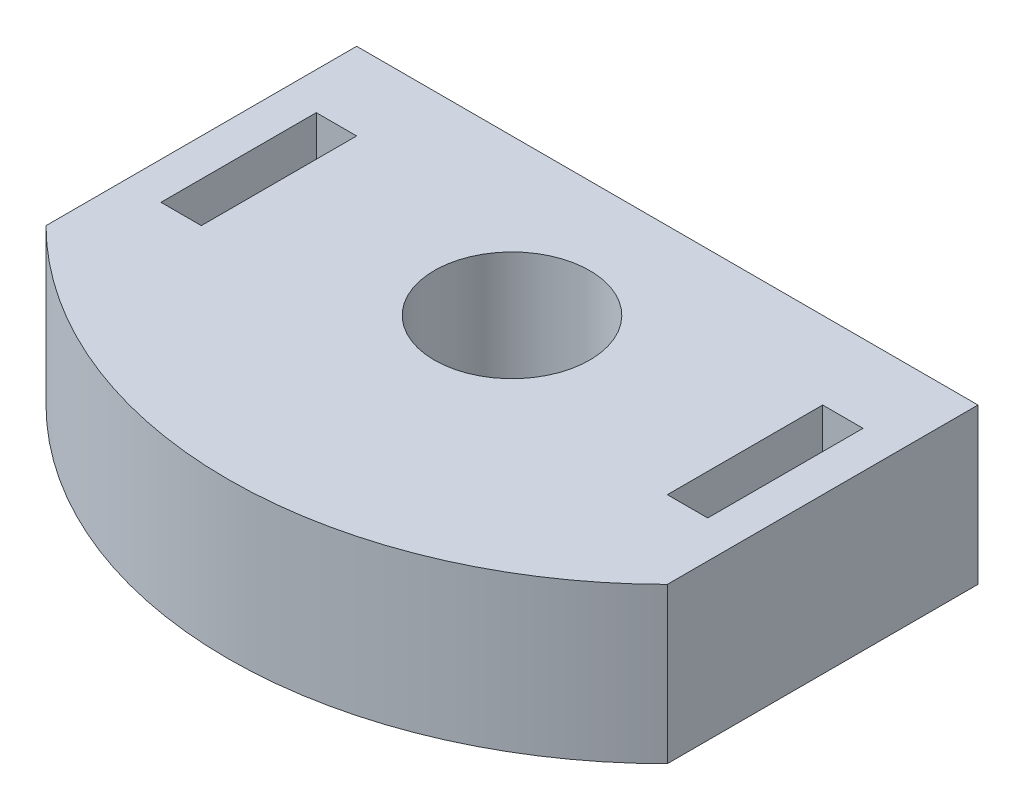
ISO-10303-21;
HEADER;
FILE_DESCRIPTION(('STEP AP214'),'2;1');
FILE_NAME('part.step','',(''),(''),'','','');
FILE_SCHEMA(('AUTOMOTIVE_DESIGN { 1 0 10303 214 1 1 1 1 }'));
ENDSEC;
DATA;
#1=APPLICATION_CONTEXT('core data for automotive mechanical design processes');
#2=APPLICATION_PROTOCOL_DEFINITION('international standard','automotive_design',2000,#1);
#3=PRODUCT_CONTEXT('',#1,'mechanical');
#4=PRODUCT('Part','Part','',(#3));
#5=PRODUCT_RELATED_PRODUCT_CATEGORY('part','',(#4));
#6=PRODUCT_DEFINITION_FORMATION('','',#4);
#7=PRODUCT_DEFINITION_CONTEXT('part definition',#1,'design');
#8=PRODUCT_DEFINITION('design','',#6,#7);
#9=PRODUCT_DEFINITION_SHAPE('','',#8);
#10=(LENGTH_UNIT() NAMED_UNIT(*) SI_UNIT(.MILLI.,.METRE.));
#11=(NAMED_UNIT(*) PLANE_ANGLE_UNIT() SI_UNIT($,.RADIAN.));
#12=(NAMED_UNIT(*) SI_UNIT($,.STERADIAN.) SOLID_ANGLE_UNIT());
#13=UNCERTAINTY_MEASURE_WITH_UNIT(LENGTH_MEASURE(1.E-05),#10,'distance_accuracy_value','');
#14=(GEOMETRIC_REPRESENTATION_CONTEXT(3) GLOBAL_UNCERTAINTY_ASSIGNED_CONTEXT((#13)) GLOBAL_UNIT_ASSIGNED_CONTEXT((#10,
#11,#12)) REPRESENTATION_CONTEXT('',''));
#15=CARTESIAN_POINT('',(0.,0.,0.));
#16=DIRECTION('',(0.,0.,1.));
#17=DIRECTION('',(1.,0.,0.));
#18=AXIS2_PLACEMENT_3D('',#15,#16,#17);
#19=CARTESIAN_POINT('',(-20.,10.,0.));
#20=DIRECTION('',(-1.,0.,0.));
#21=DIRECTION('',(0.,0.,1.));
#22=AXIS2_PLACEMENT_3D('',#19,#20,#21);
#23=PLANE('',#22);
#24=DIRECTION('',(0.,0.,-1.));
#25=VECTOR('',#24,1.);
#26=CARTESIAN_POINT('',(-20.,0.,0.));
#27=LINE('',#26,#25);
#28=CARTESIAN_POINT('',(-20.,0.,10.));
#29=VERTEX_POINT('',#28);
#30=CARTESIAN_POINT('',(-20.,0.,-10.));
#31=VERTEX_POINT('',#30);
#32=EDGE_CURVE('E237',#29,#31,#27,.T.);
#33=ORIENTED_EDGE('',*,*,#32,.F.);
#34=DIRECTION('',(0.,-1.,0.));
#35=VECTOR('',#34,1.);
#36=CARTESIAN_POINT('',(-20.,10.,10.));
#37=LINE('',#36,#35);
#38=CARTESIAN_POINT('',(-20.,10.,10.));
#39=VERTEX_POINT('',#38);
#40=EDGE_CURVE('E12',#39,#29,#37,.T.);
#41=ORIENTED_EDGE('',*,*,#40,.F.);
#42=DIRECTION('',(0.,0.,-1.));
#43=VECTOR('',#42,1.);
#44=CARTESIAN_POINT('',(-20.,10.,0.));
#45=LINE('',#44,#43);
#46=CARTESIAN_POINT('',(-20.,10.,-10.));
#47=VERTEX_POINT('',#46);
#48=EDGE_CURVE('E153',#39,#47,#45,.T.);
#49=ORIENTED_EDGE('',*,*,#48,.T.);
#50=DIRECTION('',(0.,-1.,0.));
#51=VECTOR('',#50,1.);
#52=CARTESIAN_POINT('',(-20.,10.,-10.));
#53=LINE('',#52,#51);
#54=EDGE_CURVE('E62',#47,#31,#53,.T.);
#55=ORIENTED_EDGE('',*,*,#54,.T.);
#56=EDGE_LOOP('',(#33,#41,#49,#55));
#57=FACE_BOUND('',#56,.T.);
#58=ADVANCED_FACE('F42',(#57),#23,.T.);
#59=CARTESIAN_POINT('',(0.,10.,-9.99999999999999));
#60=DIRECTION('',(0.,-1.,0.));
#61=DIRECTION('',(0.,0.,-1.));
#62=AXIS2_PLACEMENT_3D('',#59,#60,#61);
#63=CYLINDRICAL_SURFACE('',#62,28.2842712474619);
#64=CARTESIAN_POINT('',(0.,0.,-9.99999999999999));
#65=DIRECTION('',(0.,1.,0.));
#66=DIRECTION('',(0.,0.,1.));
#67=AXIS2_PLACEMENT_3D('',#64,#65,#66);
#68=CIRCLE('',#67,28.2842712474619);
#69=CARTESIAN_POINT('',(20.,0.,10.));
#70=VERTEX_POINT('',#69);
#71=EDGE_CURVE('E159',#29,#70,#68,.T.);
#72=ORIENTED_EDGE('',*,*,#71,.T.);
#73=DIRECTION('',(0.,-1.,0.));
#74=VECTOR('',#73,1.);
#75=CARTESIAN_POINT('',(20.,10.,10.));
#76=LINE('',#75,#74);
#77=CARTESIAN_POINT('',(20.,10.,10.));
#78=VERTEX_POINT('',#77);
#79=EDGE_CURVE('E53',#78,#70,#76,.T.);
#80=ORIENTED_EDGE('',*,*,#79,.F.);
#81=CARTESIAN_POINT('',(0.,10.,-9.99999999999999));
#82=DIRECTION('',(0.,1.,0.));
#83=DIRECTION('',(0.,0.,1.));
#84=AXIS2_PLACEMENT_3D('',#81,#82,#83);
#85=CIRCLE('',#84,28.2842712474619);
#86=EDGE_CURVE('E148',#39,#78,#85,.T.);
#87=ORIENTED_EDGE('',*,*,#86,.F.);
#88=ORIENTED_EDGE('',*,*,#40,.T.);
#89=EDGE_LOOP('',(#72,#80,#87,#88));
#90=FACE_BOUND('',#89,.T.);
#91=ADVANCED_FACE('F157',(#90),#63,.T.);
#92=CARTESIAN_POINT('',(20.,10.,0.));
#93=DIRECTION('',(-1.,0.,0.));
#94=DIRECTION('',(0.,0.,1.));
#95=AXIS2_PLACEMENT_3D('',#92,#93,#94);
#96=PLANE('',#95);
#97=DIRECTION('',(0.,0.,-1.));
#98=VECTOR('',#97,1.);
#99=CARTESIAN_POINT('',(20.,0.,0.));
#100=LINE('',#99,#98);
#101=CARTESIAN_POINT('',(20.,0.,-10.));
#102=VERTEX_POINT('',#101);
#103=EDGE_CURVE('E242',#70,#102,#100,.T.);
#104=ORIENTED_EDGE('',*,*,#103,.T.);
#105=DIRECTION('',(0.,-1.,0.));
#106=VECTOR('',#105,1.);
#107=CARTESIAN_POINT('',(20.,10.,-10.));
#108=LINE('',#107,#106);
#109=CARTESIAN_POINT('',(20.,10.,-10.));
#110=VERTEX_POINT('',#109);
#111=EDGE_CURVE('E100',#110,#102,#108,.T.);
#112=ORIENTED_EDGE('',*,*,#111,.F.);
#113=DIRECTION('',(0.,0.,-1.));
#114=VECTOR('',#113,1.);
#115=CARTESIAN_POINT('',(20.,10.,0.));
#116=LINE('',#115,#114);
#117=EDGE_CURVE('E139',#78,#110,#116,.T.);
#118=ORIENTED_EDGE('',*,*,#117,.F.);
#119=ORIENTED_EDGE('',*,*,#79,.T.);
#120=EDGE_LOOP('',(#104,#112,#118,#119));
#121=FACE_BOUND('',#120,.T.);
#122=ADVANCED_FACE('F141',(#121),#96,.F.);
#123=CARTESIAN_POINT('',(-15.,10.,0.));
#124=DIRECTION('',(-1.,0.,0.));
#125=DIRECTION('',(0.,0.,1.));
#126=AXIS2_PLACEMENT_3D('',#123,#124,#125);
#127=PLANE('',#126);
#128=DIRECTION('',(0.,0.,-1.));
#129=VECTOR('',#128,1.);
#130=CARTESIAN_POINT('',(-15.,0.,0.));
#131=LINE('',#130,#129);
#132=CARTESIAN_POINT('',(-15.,0.,5.));
#133=VERTEX_POINT('',#132);
#134=CARTESIAN_POINT('',(-15.,0.,-5.));
#135=VERTEX_POINT('',#134);
#136=EDGE_CURVE('E221',#133,#135,#131,.T.);
#137=ORIENTED_EDGE('',*,*,#136,.F.);
#138=DIRECTION('',(0.,-1.,0.));
#139=VECTOR('',#138,1.);
#140=CARTESIAN_POINT('',(-15.,10.,5.));
#141=LINE('',#140,#139);
#142=CARTESIAN_POINT('',(-15.,10.,5.));
#143=VERTEX_POINT('',#142);
#144=EDGE_CURVE('E176',#143,#133,#141,.T.);
#145=ORIENTED_EDGE('',*,*,#144,.F.);
#146=DIRECTION('',(0.,0.,-1.));
#147=VECTOR('',#146,1.);
#148=CARTESIAN_POINT('',(-15.,10.,0.));
#149=LINE('',#148,#147);
#150=CARTESIAN_POINT('',(-15.,10.,-5.));
#151=VERTEX_POINT('',#150);
#152=EDGE_CURVE('E279',#143,#151,#149,.T.);
#153=ORIENTED_EDGE('',*,*,#152,.T.);
#154=DIRECTION('',(0.,-1.,0.));
#155=VECTOR('',#154,1.);
#156=CARTESIAN_POINT('',(-15.,10.,-5.));
#157=LINE('',#156,#155);
#158=EDGE_CURVE('E166',#151,#135,#157,.T.);
#159=ORIENTED_EDGE('',*,*,#158,.T.);
#160=EDGE_LOOP('',(#137,#145,#153,#159));
#161=FACE_BOUND('',#160,.T.);
#162=ADVANCED_FACE('F342',(#161),#127,.T.);
#163=CARTESIAN_POINT('',(0.,10.,5.));
#164=DIRECTION('',(0.,0.,-1.));
#165=DIRECTION('',(-1.,0.,0.));
#166=AXIS2_PLACEMENT_3D('',#163,#164,#165);
#167=PLANE('',#166);
#168=DIRECTION('',(1.,0.,0.));
#169=VECTOR('',#168,1.);
#170=CARTESIAN_POINT('',(0.,0.,5.));
#171=LINE('',#170,#169);
#172=CARTESIAN_POINT('',(-17.6,0.,5.));
#173=VERTEX_POINT('',#172);
#174=EDGE_CURVE('E225',#173,#133,#171,.T.);
#175=ORIENTED_EDGE('',*,*,#174,.F.);
#176=DIRECTION('',(0.,-1.,0.));
#177=VECTOR('',#176,1.);
#178=CARTESIAN_POINT('',(-17.6,10.,5.));
#179=LINE('',#178,#177);
#180=CARTESIAN_POINT('',(-17.6,10.,5.));
#181=VERTEX_POINT('',#180);
#182=EDGE_CURVE('E173',#181,#173,#179,.T.);
#183=ORIENTED_EDGE('',*,*,#182,.F.);
#184=DIRECTION('',(1.,0.,0.));
#185=VECTOR('',#184,1.);
#186=CARTESIAN_POINT('',(0.,10.,5.));
#187=LINE('',#186,#185);
#188=EDGE_CURVE('E287',#181,#143,#187,.T.);
#189=ORIENTED_EDGE('',*,*,#188,.T.);
#190=ORIENTED_EDGE('',*,*,#144,.T.);
#191=EDGE_LOOP('',(#175,#183,#189,#190));
#192=FACE_BOUND('',#191,.T.);
#193=ADVANCED_FACE('F338',(#192),#167,.T.);
#194=CARTESIAN_POINT('',(-17.6,10.,0.));
#195=DIRECTION('',(-1.,0.,0.));
#196=DIRECTION('',(0.,0.,1.));
#197=AXIS2_PLACEMENT_3D('',#194,#195,#196);
#198=PLANE('',#197);
#199=DIRECTION('',(0.,0.,-1.));
#200=VECTOR('',#199,1.);
#201=CARTESIAN_POINT('',(-17.6,0.,0.));
#202=LINE('',#201,#200);
#203=CARTESIAN_POINT('',(-17.6,0.,-5.));
#204=VERTEX_POINT('',#203);
#205=EDGE_CURVE('E229',#173,#204,#202,.T.);
#206=ORIENTED_EDGE('',*,*,#205,.T.);
#207=DIRECTION('',(0.,-1.,0.));
#208=VECTOR('',#207,1.);
#209=CARTESIAN_POINT('',(-17.6,10.,-5.));
#210=LINE('',#209,#208);
#211=CARTESIAN_POINT('',(-17.6,10.,-5.));
#212=VERTEX_POINT('',#211);
#213=EDGE_CURVE('E169',#212,#204,#210,.T.);
#214=ORIENTED_EDGE('',*,*,#213,.F.);
#215=DIRECTION('',(0.,0.,-1.));
#216=VECTOR('',#215,1.);
#217=CARTESIAN_POINT('',(-17.6,10.,0.));
#218=LINE('',#217,#216);
#219=EDGE_CURVE('E291',#181,#212,#218,.T.);
#220=ORIENTED_EDGE('',*,*,#219,.F.);
#221=ORIENTED_EDGE('',*,*,#182,.T.);
#222=EDGE_LOOP('',(#206,#214,#220,#221));
#223=FACE_BOUND('',#222,.T.);
#224=ADVANCED_FACE('F335',(#223),#198,.F.);
#225=CARTESIAN_POINT('',(17.6,10.,0.));
#226=DIRECTION('',(-1.,0.,0.));
#227=DIRECTION('',(0.,0.,1.));
#228=AXIS2_PLACEMENT_3D('',#225,#226,#227);
#229=PLANE('',#228);
#230=DIRECTION('',(0.,0.,-1.));
#231=VECTOR('',#230,1.);
#232=CARTESIAN_POINT('',(17.6,0.,0.));
#233=LINE('',#232,#231);
#234=CARTESIAN_POINT('',(17.6,0.,5.));
#235=VERTEX_POINT('',#234);
#236=CARTESIAN_POINT('',(17.6,0.,-5.));
#237=VERTEX_POINT('',#236);
#238=EDGE_CURVE('E201',#235,#237,#233,.T.);
#239=ORIENTED_EDGE('',*,*,#238,.F.);
#240=DIRECTION('',(0.,-1.,0.));
#241=VECTOR('',#240,1.);
#242=CARTESIAN_POINT('',(17.6,10.,5.));
#243=LINE('',#242,#241);
#244=CARTESIAN_POINT('',(17.6,10.,5.));
#245=VERTEX_POINT('',#244);
#246=EDGE_CURVE('E46',#245,#235,#243,.T.);
#247=ORIENTED_EDGE('',*,*,#246,.F.);
#248=DIRECTION('',(0.,0.,-1.));
#249=VECTOR('',#248,1.);
#250=CARTESIAN_POINT('',(17.6,10.,0.));
#251=LINE('',#250,#249);
#252=CARTESIAN_POINT('',(17.6,10.,-5.));
#253=VERTEX_POINT('',#252);
#254=EDGE_CURVE('E253',#245,#253,#251,.T.);
#255=ORIENTED_EDGE('',*,*,#254,.T.);
#256=DIRECTION('',(0.,-1.,0.));
#257=VECTOR('',#256,1.);
#258=CARTESIAN_POINT('',(17.6,10.,-5.));
#259=LINE('',#258,#257);
#260=EDGE_CURVE('E179',#253,#237,#259,.T.);
#261=ORIENTED_EDGE('',*,*,#260,.T.);
#262=EDGE_LOOP('',(#239,#247,#255,#261));
#263=FACE_BOUND('',#262,.T.);
#264=ADVANCED_FACE('F202',(#263),#229,.T.);
#265=CARTESIAN_POINT('',(0.,10.,5.));
#266=DIRECTION('',(0.,0.,-1.));
#267=DIRECTION('',(-1.,0.,0.));
#268=AXIS2_PLACEMENT_3D('',#265,#266,#267);
#269=PLANE('',#268);
#270=DIRECTION('',(1.,0.,0.));
#271=VECTOR('',#270,1.);
#272=CARTESIAN_POINT('',(0.,0.,5.));
#273=LINE('',#272,#271);
#274=CARTESIAN_POINT('',(15.,0.,5.));
#275=VERTEX_POINT('',#274);
#276=EDGE_CURVE('E197',#275,#235,#273,.T.);
#277=ORIENTED_EDGE('',*,*,#276,.F.);
#278=DIRECTION('',(0.,-1.,0.));
#279=VECTOR('',#278,1.);
#280=CARTESIAN_POINT('',(15.,10.,5.));
#281=LINE('',#280,#279);
#282=CARTESIAN_POINT('',(15.,10.,5.));
#283=VERTEX_POINT('',#282);
#284=EDGE_CURVE('E185',#283,#275,#281,.T.);
#285=ORIENTED_EDGE('',*,*,#284,.F.);
#286=DIRECTION('',(1.,0.,0.));
#287=VECTOR('',#286,1.);
#288=CARTESIAN_POINT('',(0.,10.,5.));
#289=LINE('',#288,#287);
#290=EDGE_CURVE('E199',#283,#245,#289,.T.);
#291=ORIENTED_EDGE('',*,*,#290,.T.);
#292=ORIENTED_EDGE('',*,*,#246,.T.);
#293=EDGE_LOOP('',(#277,#285,#291,#292));
#294=FACE_BOUND('',#293,.T.);
#295=ADVANCED_FACE('F195',(#294),#269,.T.);
#296=CARTESIAN_POINT('',(15.,10.,0.));
#297=DIRECTION('',(-1.,0.,0.));
#298=DIRECTION('',(0.,0.,1.));
#299=AXIS2_PLACEMENT_3D('',#296,#297,#298);
#300=PLANE('',#299);
#301=DIRECTION('',(0.,0.,-1.));
#302=VECTOR('',#301,1.);
#303=CARTESIAN_POINT('',(15.,0.,0.));
#304=LINE('',#303,#302);
#305=CARTESIAN_POINT('',(15.,0.,-5.));
#306=VERTEX_POINT('',#305);
#307=EDGE_CURVE('E211',#275,#306,#304,.T.);
#308=ORIENTED_EDGE('',*,*,#307,.T.);
#309=DIRECTION('',(0.,-1.,0.));
#310=VECTOR('',#309,1.);
#311=CARTESIAN_POINT('',(15.,10.,-5.));
#312=LINE('',#311,#310);
#313=CARTESIAN_POINT('',(15.,10.,-5.));
#314=VERTEX_POINT('',#313);
#315=EDGE_CURVE('E182',#314,#306,#312,.T.);
#316=ORIENTED_EDGE('',*,*,#315,.F.);
#317=DIRECTION('',(0.,0.,-1.));
#318=VECTOR('',#317,1.);
#319=CARTESIAN_POINT('',(15.,10.,0.));
#320=LINE('',#319,#318);
#321=EDGE_CURVE('E270',#283,#314,#320,.T.);
#322=ORIENTED_EDGE('',*,*,#321,.F.);
#323=ORIENTED_EDGE('',*,*,#284,.T.);
#324=EDGE_LOOP('',(#308,#316,#322,#323));
#325=FACE_BOUND('',#324,.T.);
#326=ADVANCED_FACE('F333',(#325),#300,.F.);
#327=CARTESIAN_POINT('',(0.,10.,-5.00000000000001));
#328=DIRECTION('',(0.,0.,-1.));
#329=DIRECTION('',(-1.,0.,0.));
#330=AXIS2_PLACEMENT_3D('',#327,#328,#329);
#331=PLANE('',#330);
#332=DIRECTION('',(1.,0.,0.));
#333=VECTOR('',#332,1.);
#334=CARTESIAN_POINT('',(0.,0.,-5.00000000000001));
#335=LINE('',#334,#333);
#336=EDGE_CURVE('E233',#204,#135,#335,.T.);
#337=ORIENTED_EDGE('',*,*,#336,.T.);
#338=ORIENTED_EDGE('',*,*,#158,.F.);
#339=DIRECTION('',(1.,0.,0.));
#340=VECTOR('',#339,1.);
#341=CARTESIAN_POINT('',(0.,10.,-5.00000000000001));
#342=LINE('',#341,#340);
#343=EDGE_CURVE('E296',#212,#151,#342,.T.);
#344=ORIENTED_EDGE('',*,*,#343,.F.);
#345=ORIENTED_EDGE('',*,*,#213,.T.);
#346=EDGE_LOOP('',(#337,#338,#344,#345));
#347=FACE_BOUND('',#346,.T.);
#348=ADVANCED_FACE('F320',(#347),#331,.F.);
#349=CARTESIAN_POINT('',(0.,10.,-5.));
#350=DIRECTION('',(0.,0.,-1.));
#351=DIRECTION('',(-1.,0.,0.));
#352=AXIS2_PLACEMENT_3D('',#349,#350,#351);
#353=PLANE('',#352);
#354=DIRECTION('',(1.,0.,0.));
#355=VECTOR('',#354,1.);
#356=CARTESIAN_POINT('',(0.,0.,-5.));
#357=LINE('',#356,#355);
#358=EDGE_CURVE('E215',#306,#237,#357,.T.);
#359=ORIENTED_EDGE('',*,*,#358,.T.);
#360=ORIENTED_EDGE('',*,*,#260,.F.);
#361=DIRECTION('',(1.,0.,0.));
#362=VECTOR('',#361,1.);
#363=CARTESIAN_POINT('',(0.,10.,-5.));
#364=LINE('',#363,#362);
#365=EDGE_CURVE('E275',#314,#253,#364,.T.);
#366=ORIENTED_EDGE('',*,*,#365,.F.);
#367=ORIENTED_EDGE('',*,*,#315,.T.);
#368=EDGE_LOOP('',(#359,#360,#366,#367));
#369=FACE_BOUND('',#368,.T.);
#370=ADVANCED_FACE('F314',(#369),#353,.F.);
#371=CARTESIAN_POINT('',(0.,10.,0.));
#372=DIRECTION('',(0.,-1.,0.));
#373=DIRECTION('',(0.,0.,-1.));
#374=AXIS2_PLACEMENT_3D('',#371,#372,#373);
#375=CYLINDRICAL_SURFACE('',#374,5.);
#376=CARTESIAN_POINT('',(0.,10.,0.));
#377=DIRECTION('',(0.,1.,0.));
#378=DIRECTION('',(0.,0.,1.));
#379=AXIS2_PLACEMENT_3D('',#376,#377,#378);
#380=CIRCLE('',#379,5.);
#381=CARTESIAN_POINT('',(0.,10.,5.));
#382=VERTEX_POINT('',#381);
#383=EDGE_CURVE('E248',#382,#382,#380,.T.);
#384=ORIENTED_EDGE('',*,*,#383,.T.);
#385=EDGE_LOOP('',(#384));
#386=FACE_BOUND('',#385,.T.);
#387=CARTESIAN_POINT('',(0.,0.,0.));
#388=DIRECTION('',(0.,1.,0.));
#389=DIRECTION('',(0.,0.,1.));
#390=AXIS2_PLACEMENT_3D('',#387,#388,#389);
#391=CIRCLE('',#390,5.);
#392=CARTESIAN_POINT('',(0.,0.,5.));
#393=VERTEX_POINT('',#392);
#394=EDGE_CURVE('E207',#393,#393,#391,.T.);
#395=ORIENTED_EDGE('',*,*,#394,.F.);
#396=EDGE_LOOP('',(#395));
#397=FACE_BOUND('',#396,.T.);
#398=ADVANCED_FACE('F44',(#386,#397),#375,.F.);
#399=CARTESIAN_POINT('',(0.,10.,-10.));
#400=DIRECTION('',(0.,0.,-1.));
#401=DIRECTION('',(-1.,0.,0.));
#402=AXIS2_PLACEMENT_3D('',#399,#400,#401);
#403=PLANE('',#402);
#404=DIRECTION('',(1.,0.,0.));
#405=VECTOR('',#404,1.);
#406=CARTESIAN_POINT('',(0.,0.,-10.));
#407=LINE('',#406,#405);
#408=EDGE_CURVE('E245',#31,#102,#407,.T.);
#409=ORIENTED_EDGE('',*,*,#408,.F.);
#410=ORIENTED_EDGE('',*,*,#54,.F.);
#411=DIRECTION('',(1.,0.,0.));
#412=VECTOR('',#411,1.);
#413=CARTESIAN_POINT('',(0.,10.,-10.));
#414=LINE('',#413,#412);
#415=EDGE_CURVE('E147',#47,#110,#414,.T.);
#416=ORIENTED_EDGE('',*,*,#415,.T.);
#417=ORIENTED_EDGE('',*,*,#111,.T.);
#418=EDGE_LOOP('',(#409,#410,#416,#417));
#419=FACE_BOUND('',#418,.T.);
#420=ADVANCED_FACE('F313',(#419),#403,.T.);
#421=CARTESIAN_POINT('',(0.,10.,0.));
#422=DIRECTION('',(0.,1.,0.));
#423=DIRECTION('',(0.,0.,1.));
#424=AXIS2_PLACEMENT_3D('',#421,#422,#423);
#425=PLANE('',#424);
#426=ORIENTED_EDGE('',*,*,#383,.F.);
#427=EDGE_LOOP('',(#426));
#428=FACE_BOUND('',#427,.T.);
#429=ORIENTED_EDGE('',*,*,#254,.F.);
#430=ORIENTED_EDGE('',*,*,#290,.F.);
#431=ORIENTED_EDGE('',*,*,#321,.T.);
#432=ORIENTED_EDGE('',*,*,#365,.T.);
#433=EDGE_LOOP('',(#429,#430,#431,#432));
#434=FACE_BOUND('',#433,.T.);
#435=ORIENTED_EDGE('',*,*,#152,.F.);
#436=ORIENTED_EDGE('',*,*,#188,.F.);
#437=ORIENTED_EDGE('',*,*,#219,.T.);
#438=ORIENTED_EDGE('',*,*,#343,.T.);
#439=EDGE_LOOP('',(#435,#436,#437,#438));
#440=FACE_BOUND('',#439,.T.);
#441=ORIENTED_EDGE('',*,*,#48,.F.);
#442=ORIENTED_EDGE('',*,*,#86,.T.);
#443=ORIENTED_EDGE('',*,*,#117,.T.);
#444=ORIENTED_EDGE('',*,*,#415,.F.);
#445=EDGE_LOOP('',(#441,#442,#443,#444));
#446=FACE_BOUND('',#445,.T.);
#447=ADVANCED_FACE('F152',(#428,#434,#440,#446),#425,.T.);
#448=CARTESIAN_POINT('',(0.,0.,0.));
#449=DIRECTION('',(0.,1.,0.));
#450=DIRECTION('',(0.,0.,1.));
#451=AXIS2_PLACEMENT_3D('',#448,#449,#450);
#452=PLANE('',#451);
#453=ORIENTED_EDGE('',*,*,#394,.T.);
#454=EDGE_LOOP('',(#453));
#455=FACE_BOUND('',#454,.T.);
#456=ORIENTED_EDGE('',*,*,#238,.T.);
#457=ORIENTED_EDGE('',*,*,#358,.F.);
#458=ORIENTED_EDGE('',*,*,#307,.F.);
#459=ORIENTED_EDGE('',*,*,#276,.T.);
#460=EDGE_LOOP('',(#456,#457,#458,#459));
#461=FACE_BOUND('',#460,.T.);
#462=ORIENTED_EDGE('',*,*,#136,.T.);
#463=ORIENTED_EDGE('',*,*,#336,.F.);
#464=ORIENTED_EDGE('',*,*,#205,.F.);
#465=ORIENTED_EDGE('',*,*,#174,.T.);
#466=EDGE_LOOP('',(#462,#463,#464,#465));
#467=FACE_BOUND('',#466,.T.);
#468=ORIENTED_EDGE('',*,*,#32,.T.);
#469=ORIENTED_EDGE('',*,*,#408,.T.);
#470=ORIENTED_EDGE('',*,*,#103,.F.);
#471=ORIENTED_EDGE('',*,*,#71,.F.);
#472=EDGE_LOOP('',(#468,#469,#470,#471));
#473=FACE_BOUND('',#472,.T.);
#474=ADVANCED_FACE('F209',(#455,#461,#467,#473),#452,.F.);
#475=CLOSED_SHELL('',(#58,#91,#122,#162,#193,#224,#264,#295,#326,#348,#370,#398,#420,#447,#474));
#476=MANIFOLD_SOLID_BREP('B2',#475);
#477=ADVANCED_BREP_SHAPE_REPRESENTATION('',(#18,#476),#14);
#478=SHAPE_DEFINITION_REPRESENTATION(#9,#477);
ENDSEC;
END-ISO-10303-21;
